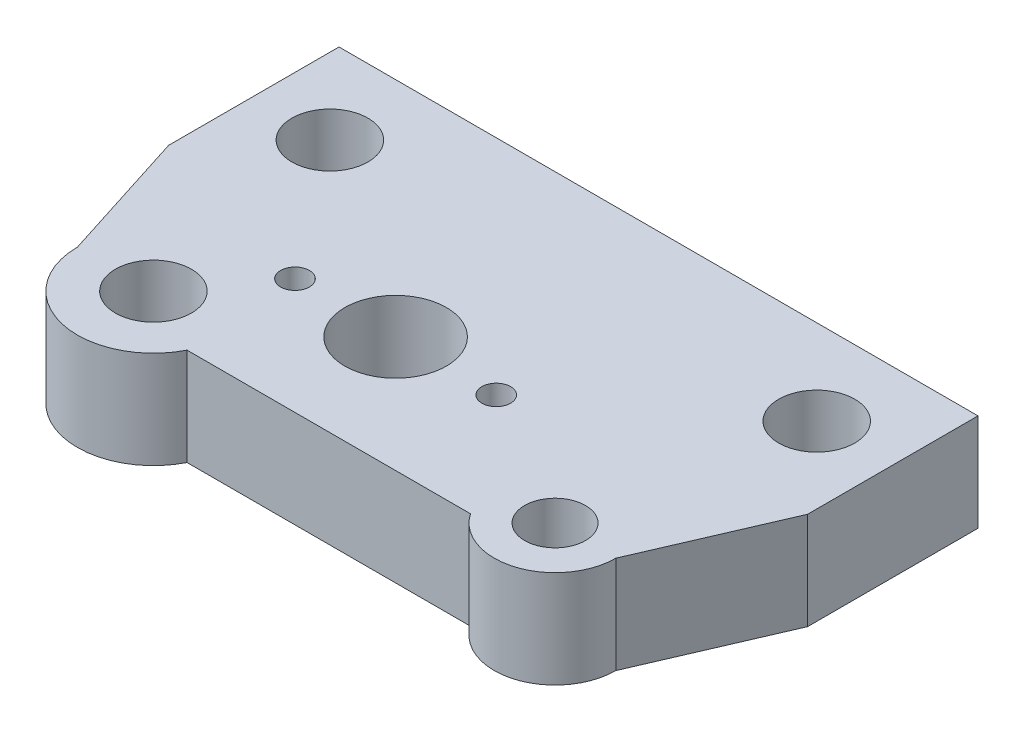
ISO-10303-21;
HEADER;
FILE_DESCRIPTION(('STEP AP214'),'2;1');
FILE_NAME('part.step','',(''),(''),'','','');
FILE_SCHEMA(('AUTOMOTIVE_DESIGN { 1 0 10303 214 1 1 1 1 }'));
ENDSEC;
DATA;
#1=APPLICATION_CONTEXT('core data for automotive mechanical design processes');
#2=APPLICATION_PROTOCOL_DEFINITION('international standard','automotive_design',2000,#1);
#3=PRODUCT_CONTEXT('',#1,'mechanical');
#4=PRODUCT('Part','Part','',(#3));
#5=PRODUCT_RELATED_PRODUCT_CATEGORY('part','',(#4));
#6=PRODUCT_DEFINITION_FORMATION('','',#4);
#7=PRODUCT_DEFINITION_CONTEXT('part definition',#1,'design');
#8=PRODUCT_DEFINITION('design','',#6,#7);
#9=PRODUCT_DEFINITION_SHAPE('','',#8);
#10=(LENGTH_UNIT() NAMED_UNIT(*) SI_UNIT(.MILLI.,.METRE.));
#11=(NAMED_UNIT(*) PLANE_ANGLE_UNIT() SI_UNIT($,.RADIAN.));
#12=(NAMED_UNIT(*) SI_UNIT($,.STERADIAN.) SOLID_ANGLE_UNIT());
#13=UNCERTAINTY_MEASURE_WITH_UNIT(LENGTH_MEASURE(1.E-05),#10,'distance_accuracy_value','');
#14=(GEOMETRIC_REPRESENTATION_CONTEXT(3) GLOBAL_UNCERTAINTY_ASSIGNED_CONTEXT((#13)) GLOBAL_UNIT_ASSIGNED_CONTEXT((#10,
#11,#12)) REPRESENTATION_CONTEXT('',''));
#15=CARTESIAN_POINT('',(0.,0.,0.));
#16=DIRECTION('',(0.,0.,1.));
#17=DIRECTION('',(1.,0.,0.));
#18=AXIS2_PLACEMENT_3D('',#15,#16,#17);
#19=CARTESIAN_POINT('',(41.91,-10.16,0.));
#20=DIRECTION('',(0.,1.,0.));
#21=DIRECTION('',(0.,0.,1.));
#22=AXIS2_PLACEMENT_3D('',#19,#20,#21);
#23=CYLINDRICAL_SURFACE('',#22,6.35);
#24=CARTESIAN_POINT('',(41.91,0.,0.));
#25=DIRECTION('',(0.,1.,0.));
#26=DIRECTION('',(0.,0.,1.));
#27=AXIS2_PLACEMENT_3D('',#24,#25,#26);
#28=CIRCLE('',#27,6.35);
#29=CARTESIAN_POINT('',(36.662919386102,0.,3.57640112840493));
#30=VERTEX_POINT('',#29);
#31=CARTESIAN_POINT('',(48.26,0.,0.));
#32=VERTEX_POINT('',#31);
#33=EDGE_CURVE('E133',#30,#32,#28,.T.);
#34=ORIENTED_EDGE('',*,*,#33,.F.);
#35=DIRECTION('',(0.,1.,0.));
#36=VECTOR('',#35,1.);
#37=CARTESIAN_POINT('',(36.662919386102,-10.16,3.57640112840493));
#38=LINE('',#37,#36);
#39=CARTESIAN_POINT('',(36.662919386102,-10.16,3.57640112840493));
#40=VERTEX_POINT('',#39);
#41=EDGE_CURVE('E11',#40,#30,#38,.T.);
#42=ORIENTED_EDGE('',*,*,#41,.F.);
#43=CARTESIAN_POINT('',(41.91,-10.16,0.));
#44=DIRECTION('',(0.,1.,0.));
#45=DIRECTION('',(0.,0.,1.));
#46=AXIS2_PLACEMENT_3D('',#43,#44,#45);
#47=CIRCLE('',#46,6.35);
#48=CARTESIAN_POINT('',(48.26,-10.16,0.));
#49=VERTEX_POINT('',#48);
#50=EDGE_CURVE('E154',#40,#49,#47,.T.);
#51=ORIENTED_EDGE('',*,*,#50,.T.);
#52=DIRECTION('',(0.,1.,0.));
#53=VECTOR('',#52,1.);
#54=CARTESIAN_POINT('',(48.26,-10.16,0.));
#55=LINE('',#54,#53);
#56=EDGE_CURVE('E39',#49,#32,#55,.T.);
#57=ORIENTED_EDGE('',*,*,#56,.T.);
#58=EDGE_LOOP('',(#34,#42,#51,#57));
#59=FACE_BOUND('',#58,.T.);
#60=ADVANCED_FACE('F36',(#59),#23,.T.);
#61=CARTESIAN_POINT('',(7.08613161172892,-10.16,3.57640112840493));
#62=DIRECTION('',(0.,0.,1.));
#63=DIRECTION('',(1.,0.,0.));
#64=AXIS2_PLACEMENT_3D('',#61,#62,#63);
#65=PLANE('',#64);
#66=DIRECTION('',(1.,0.,0.));
#67=VECTOR('',#66,1.);
#68=CARTESIAN_POINT('',(7.08613161172892,0.,3.57640112840493));
#69=LINE('',#68,#67);
#70=CARTESIAN_POINT('',(7.08613161172892,0.,3.57640112840493));
#71=VERTEX_POINT('',#70);
#72=EDGE_CURVE('E152',#71,#30,#69,.T.);
#73=ORIENTED_EDGE('',*,*,#72,.F.);
#74=DIRECTION('',(0.,1.,0.));
#75=VECTOR('',#74,1.);
#76=CARTESIAN_POINT('',(7.08613161172892,-10.16,3.57640112840493));
#77=LINE('',#76,#75);
#78=CARTESIAN_POINT('',(7.08613161172892,-10.16,3.57640112840493));
#79=VERTEX_POINT('',#78);
#80=EDGE_CURVE('E45',#79,#71,#77,.T.);
#81=ORIENTED_EDGE('',*,*,#80,.F.);
#82=DIRECTION('',(1.,0.,0.));
#83=VECTOR('',#82,1.);
#84=CARTESIAN_POINT('',(7.08613161172892,-10.16,3.57640112840493));
#85=LINE('',#84,#83);
#86=EDGE_CURVE('E123',#79,#40,#85,.T.);
#87=ORIENTED_EDGE('',*,*,#86,.T.);
#88=ORIENTED_EDGE('',*,*,#41,.T.);
#89=EDGE_LOOP('',(#73,#81,#87,#88));
#90=FACE_BOUND('',#89,.T.);
#91=ADVANCED_FACE('F166',(#90),#65,.T.);
#92=CARTESIAN_POINT('',(0.,-10.16,0.));
#93=DIRECTION('',(0.,1.,0.));
#94=DIRECTION('',(0.,0.,1.));
#95=AXIS2_PLACEMENT_3D('',#92,#93,#94);
#96=CYLINDRICAL_SURFACE('',#95,7.9375);
#97=CARTESIAN_POINT('',(0.,0.,0.));
#98=DIRECTION('',(0.,1.,0.));
#99=DIRECTION('',(0.,0.,-1.));
#100=AXIS2_PLACEMENT_3D('',#97,#98,#99);
#101=CIRCLE('',#100,7.9375);
#102=CARTESIAN_POINT('',(-7.9375,0.,0.));
#103=VERTEX_POINT('',#102);
#104=EDGE_CURVE('E110',#103,#71,#101,.T.);
#105=ORIENTED_EDGE('',*,*,#104,.F.);
#106=DIRECTION('',(0.,1.,0.));
#107=VECTOR('',#106,1.);
#108=CARTESIAN_POINT('',(-7.9375,-10.16,0.));
#109=LINE('',#108,#107);
#110=CARTESIAN_POINT('',(-7.9375,-10.16,0.));
#111=VERTEX_POINT('',#110);
#112=EDGE_CURVE('E105',#111,#103,#109,.T.);
#113=ORIENTED_EDGE('',*,*,#112,.F.);
#114=CARTESIAN_POINT('',(0.,-10.16,0.));
#115=DIRECTION('',(0.,1.,0.));
#116=DIRECTION('',(0.,0.,-1.));
#117=AXIS2_PLACEMENT_3D('',#114,#115,#116);
#118=CIRCLE('',#117,7.9375);
#119=EDGE_CURVE('E108',#111,#79,#118,.T.);
#120=ORIENTED_EDGE('',*,*,#119,.T.);
#121=ORIENTED_EDGE('',*,*,#80,.T.);
#122=EDGE_LOOP('',(#105,#113,#120,#121));
#123=FACE_BOUND('',#122,.T.);
#124=ADVANCED_FACE('F107',(#123),#96,.T.);
#125=CARTESIAN_POINT('',(-7.9375,-10.16,0.));
#126=DIRECTION('',(-0.952925780013262,0.,0.303203657276947));
#127=DIRECTION('',(0.303203657276947,0.,0.952925780013262));
#128=AXIS2_PLACEMENT_3D('',#125,#126,#127);
#129=PLANE('',#128);
#130=DIRECTION('',(0.303203657276947,0.,0.952925780013262));
#131=VECTOR('',#130,1.);
#132=CARTESIAN_POINT('',(-7.9375,0.,0.));
#133=LINE('',#132,#131);
#134=CARTESIAN_POINT('',(-12.3825,0.,-13.97));
#135=VERTEX_POINT('',#134);
#136=EDGE_CURVE('E149',#135,#103,#133,.T.);
#137=ORIENTED_EDGE('',*,*,#136,.F.);
#138=DIRECTION('',(0.,1.,0.));
#139=VECTOR('',#138,1.);
#140=CARTESIAN_POINT('',(-12.3825,-10.16,-13.97));
#141=LINE('',#140,#139);
#142=CARTESIAN_POINT('',(-12.3825,-10.16,-13.97));
#143=VERTEX_POINT('',#142);
#144=EDGE_CURVE('E115',#143,#135,#141,.T.);
#145=ORIENTED_EDGE('',*,*,#144,.F.);
#146=DIRECTION('',(0.303203657276947,0.,0.952925780013262));
#147=VECTOR('',#146,1.);
#148=CARTESIAN_POINT('',(-7.9375,-10.16,0.));
#149=LINE('',#148,#147);
#150=EDGE_CURVE('E121',#143,#111,#149,.T.);
#151=ORIENTED_EDGE('',*,*,#150,.T.);
#152=ORIENTED_EDGE('',*,*,#112,.T.);
#153=EDGE_LOOP('',(#137,#145,#151,#152));
#154=FACE_BOUND('',#153,.T.);
#155=ADVANCED_FACE('F125',(#154),#129,.T.);
#156=CARTESIAN_POINT('',(-12.3825,-10.16,-31.75));
#157=DIRECTION('',(-1.,0.,0.));
#158=DIRECTION('',(0.,0.,1.));
#159=AXIS2_PLACEMENT_3D('',#156,#157,#158);
#160=PLANE('',#159);
#161=DIRECTION('',(0.,0.,1.));
#162=VECTOR('',#161,1.);
#163=CARTESIAN_POINT('',(-12.3825,0.,-31.75));
#164=LINE('',#163,#162);
#165=CARTESIAN_POINT('',(-12.3825,0.,-31.75));
#166=VERTEX_POINT('',#165);
#167=EDGE_CURVE('E146',#166,#135,#164,.T.);
#168=ORIENTED_EDGE('',*,*,#167,.F.);
#169=DIRECTION('',(0.,1.,0.));
#170=VECTOR('',#169,1.);
#171=CARTESIAN_POINT('',(-12.3825,-10.16,-31.75));
#172=LINE('',#171,#170);
#173=CARTESIAN_POINT('',(-12.3825,-10.16,-31.75));
#174=VERTEX_POINT('',#173);
#175=EDGE_CURVE('E158',#174,#166,#172,.T.);
#176=ORIENTED_EDGE('',*,*,#175,.F.);
#177=DIRECTION('',(0.,0.,1.));
#178=VECTOR('',#177,1.);
#179=CARTESIAN_POINT('',(-12.3825,-10.16,-31.75));
#180=LINE('',#179,#178);
#181=EDGE_CURVE('E126',#174,#143,#180,.T.);
#182=ORIENTED_EDGE('',*,*,#181,.T.);
#183=ORIENTED_EDGE('',*,*,#144,.T.);
#184=EDGE_LOOP('',(#168,#176,#182,#183));
#185=FACE_BOUND('',#184,.T.);
#186=ADVANCED_FACE('F179',(#185),#160,.T.);
#187=CARTESIAN_POINT('',(54.2925,-10.16,-31.75));
#188=DIRECTION('',(0.,0.,-1.));
#189=DIRECTION('',(-1.,0.,0.));
#190=AXIS2_PLACEMENT_3D('',#187,#188,#189);
#191=PLANE('',#190);
#192=DIRECTION('',(-1.,0.,0.));
#193=VECTOR('',#192,1.);
#194=CARTESIAN_POINT('',(54.2925,0.,-31.75));
#195=LINE('',#194,#193);
#196=CARTESIAN_POINT('',(54.2925,0.,-31.75));
#197=VERTEX_POINT('',#196);
#198=EDGE_CURVE('E143',#197,#166,#195,.T.);
#199=ORIENTED_EDGE('',*,*,#198,.F.);
#200=DIRECTION('',(0.,1.,0.));
#201=VECTOR('',#200,1.);
#202=CARTESIAN_POINT('',(54.2925,-10.16,-31.75));
#203=LINE('',#202,#201);
#204=CARTESIAN_POINT('',(54.2925,-10.16,-31.75));
#205=VERTEX_POINT('',#204);
#206=EDGE_CURVE('E160',#205,#197,#203,.T.);
#207=ORIENTED_EDGE('',*,*,#206,.F.);
#208=DIRECTION('',(-1.,0.,0.));
#209=VECTOR('',#208,1.);
#210=CARTESIAN_POINT('',(54.2925,-10.16,-31.75));
#211=LINE('',#210,#209);
#212=EDGE_CURVE('E128',#205,#174,#211,.T.);
#213=ORIENTED_EDGE('',*,*,#212,.T.);
#214=ORIENTED_EDGE('',*,*,#175,.T.);
#215=EDGE_LOOP('',(#199,#207,#213,#214));
#216=FACE_BOUND('',#215,.T.);
#217=ADVANCED_FACE('F182',(#216),#191,.T.);
#218=CARTESIAN_POINT('',(54.2925,-10.16,-31.75));
#219=DIRECTION('',(1.,0.,0.));
#220=DIRECTION('',(0.,0.,-1.));
#221=AXIS2_PLACEMENT_3D('',#218,#219,#220);
#222=PLANE('',#221);
#223=DIRECTION('',(0.,0.,-1.));
#224=VECTOR('',#223,1.);
#225=CARTESIAN_POINT('',(54.2925,0.,-31.75));
#226=LINE('',#225,#224);
#227=CARTESIAN_POINT('',(54.2925,0.,-13.97));
#228=VERTEX_POINT('',#227);
#229=EDGE_CURVE('E140',#228,#197,#226,.T.);
#230=ORIENTED_EDGE('',*,*,#229,.F.);
#231=DIRECTION('',(0.,1.,0.));
#232=VECTOR('',#231,1.);
#233=CARTESIAN_POINT('',(54.2925,-10.16,-13.97));
#234=LINE('',#233,#232);
#235=CARTESIAN_POINT('',(54.2925,-10.16,-13.97));
#236=VERTEX_POINT('',#235);
#237=EDGE_CURVE('E161',#236,#228,#234,.T.);
#238=ORIENTED_EDGE('',*,*,#237,.F.);
#239=DIRECTION('',(0.,0.,-1.));
#240=VECTOR('',#239,1.);
#241=CARTESIAN_POINT('',(54.2925,-10.16,-31.75));
#242=LINE('',#241,#240);
#243=EDGE_CURVE('E278',#236,#205,#242,.T.);
#244=ORIENTED_EDGE('',*,*,#243,.T.);
#245=ORIENTED_EDGE('',*,*,#206,.T.);
#246=EDGE_LOOP('',(#230,#238,#244,#245));
#247=FACE_BOUND('',#246,.T.);
#248=ADVANCED_FACE('F186',(#247),#222,.T.);
#249=CARTESIAN_POINT('',(48.26,-10.16,0.));
#250=DIRECTION('',(0.918062353536191,0.,0.396436016299718));
#251=DIRECTION('',(0.396436016299718,0.,-0.918062353536191));
#252=AXIS2_PLACEMENT_3D('',#249,#250,#251);
#253=PLANE('',#252);
#254=DIRECTION('',(0.396436016299718,0.,-0.918062353536191));
#255=VECTOR('',#254,1.);
#256=CARTESIAN_POINT('',(48.26,0.,0.));
#257=LINE('',#256,#255);
#258=EDGE_CURVE('E136',#32,#228,#257,.T.);
#259=ORIENTED_EDGE('',*,*,#258,.F.);
#260=ORIENTED_EDGE('',*,*,#56,.F.);
#261=DIRECTION('',(0.396436016299718,0.,-0.918062353536191));
#262=VECTOR('',#261,1.);
#263=CARTESIAN_POINT('',(48.26,-10.16,0.));
#264=LINE('',#263,#262);
#265=EDGE_CURVE('E276',#49,#236,#264,.T.);
#266=ORIENTED_EDGE('',*,*,#265,.T.);
#267=ORIENTED_EDGE('',*,*,#237,.T.);
#268=EDGE_LOOP('',(#259,#260,#266,#267));
#269=FACE_BOUND('',#268,.T.);
#270=ADVANCED_FACE('F163',(#269),#253,.T.);
#271=CARTESIAN_POINT('',(41.91,-10.16,0.));
#272=DIRECTION('',(0.,1.,0.));
#273=DIRECTION('',(0.,0.,1.));
#274=AXIS2_PLACEMENT_3D('',#271,#272,#273);
#275=PLANE('',#274);
#276=CARTESIAN_POINT('',(27.264,-10.16,-8.50900000000001));
#277=DIRECTION('',(0.,1.,0.));
#278=DIRECTION('',(0.,0.,1.));
#279=AXIS2_PLACEMENT_3D('',#276,#277,#278);
#280=CIRCLE('',#279,1.5);
#281=CARTESIAN_POINT('',(27.264,-10.16,-7.009));
#282=VERTEX_POINT('',#281);
#283=EDGE_CURVE('E233',#282,#282,#280,.T.);
#284=ORIENTED_EDGE('',*,*,#283,.T.);
#285=EDGE_LOOP('',(#284));
#286=FACE_BOUND('',#285,.T.);
#287=CARTESIAN_POINT('',(6.264,-10.16,-8.509));
#288=DIRECTION('',(0.,1.,0.));
#289=DIRECTION('',(0.,0.,1.));
#290=AXIS2_PLACEMENT_3D('',#287,#288,#289);
#291=CIRCLE('',#290,1.5);
#292=CARTESIAN_POINT('',(6.264,-10.16,-7.009));
#293=VERTEX_POINT('',#292);
#294=EDGE_CURVE('E241',#293,#293,#291,.T.);
#295=ORIENTED_EDGE('',*,*,#294,.T.);
#296=EDGE_LOOP('',(#295));
#297=FACE_BOUND('',#296,.T.);
#298=CARTESIAN_POINT('',(16.764,-10.16,-8.509));
#299=DIRECTION('',(0.,1.,0.));
#300=DIRECTION('',(0.,0.,1.));
#301=AXIS2_PLACEMENT_3D('',#298,#299,#300);
#302=CIRCLE('',#301,5.30000000000002);
#303=CARTESIAN_POINT('',(16.764,-10.16,-3.20899999999999));
#304=VERTEX_POINT('',#303);
#305=EDGE_CURVE('E247',#304,#304,#302,.T.);
#306=ORIENTED_EDGE('',*,*,#305,.T.);
#307=EDGE_LOOP('',(#306));
#308=FACE_BOUND('',#307,.T.);
#309=CARTESIAN_POINT('',(-4.445,-10.16,-22.86));
#310=DIRECTION('',(0.,1.,0.));
#311=DIRECTION('',(0.,0.,1.));
#312=AXIS2_PLACEMENT_3D('',#309,#310,#311);
#313=CIRCLE('',#312,3.96875);
#314=CARTESIAN_POINT('',(-4.445,-10.16,-18.89125));
#315=VERTEX_POINT('',#314);
#316=EDGE_CURVE('E253',#315,#315,#313,.T.);
#317=ORIENTED_EDGE('',*,*,#316,.T.);
#318=EDGE_LOOP('',(#317));
#319=FACE_BOUND('',#318,.T.);
#320=CARTESIAN_POINT('',(46.355,-10.16,-22.86));
#321=DIRECTION('',(0.,1.,0.));
#322=DIRECTION('',(0.,0.,1.));
#323=AXIS2_PLACEMENT_3D('',#320,#321,#322);
#324=CIRCLE('',#323,3.96875000000001);
#325=CARTESIAN_POINT('',(46.355,-10.16,-18.89125));
#326=VERTEX_POINT('',#325);
#327=EDGE_CURVE('E259',#326,#326,#324,.T.);
#328=ORIENTED_EDGE('',*,*,#327,.T.);
#329=EDGE_LOOP('',(#328));
#330=FACE_BOUND('',#329,.T.);
#331=CARTESIAN_POINT('',(41.91,-10.16,0.));
#332=DIRECTION('',(0.,1.,0.));
#333=DIRECTION('',(0.,0.,1.));
#334=AXIS2_PLACEMENT_3D('',#331,#332,#333);
#335=CIRCLE('',#334,3.175);
#336=CARTESIAN_POINT('',(41.91,-10.16,3.175));
#337=VERTEX_POINT('',#336);
#338=EDGE_CURVE('E265',#337,#337,#335,.T.);
#339=ORIENTED_EDGE('',*,*,#338,.T.);
#340=EDGE_LOOP('',(#339));
#341=FACE_BOUND('',#340,.T.);
#342=CARTESIAN_POINT('',(0.,-10.16,0.));
#343=DIRECTION('',(0.,1.,0.));
#344=DIRECTION('',(0.,0.,1.));
#345=AXIS2_PLACEMENT_3D('',#342,#343,#344);
#346=CIRCLE('',#345,3.96875);
#347=CARTESIAN_POINT('',(0.,-10.16,3.96875));
#348=VERTEX_POINT('',#347);
#349=EDGE_CURVE('E137',#348,#348,#346,.T.);
#350=ORIENTED_EDGE('',*,*,#349,.T.);
#351=EDGE_LOOP('',(#350));
#352=FACE_BOUND('',#351,.T.);
#353=ORIENTED_EDGE('',*,*,#50,.F.);
#354=ORIENTED_EDGE('',*,*,#86,.F.);
#355=ORIENTED_EDGE('',*,*,#119,.F.);
#356=ORIENTED_EDGE('',*,*,#150,.F.);
#357=ORIENTED_EDGE('',*,*,#181,.F.);
#358=ORIENTED_EDGE('',*,*,#212,.F.);
#359=ORIENTED_EDGE('',*,*,#243,.F.);
#360=ORIENTED_EDGE('',*,*,#265,.F.);
#361=EDGE_LOOP('',(#353,#354,#355,#356,#357,#358,#359,#360));
#362=FACE_BOUND('',#361,.T.);
#363=ADVANCED_FACE('F119',(#286,#297,#308,#319,#330,#341,#352,#362),#275,.F.);
#364=CARTESIAN_POINT('',(41.91,0.,0.));
#365=DIRECTION('',(0.,1.,0.));
#366=DIRECTION('',(0.,0.,1.));
#367=AXIS2_PLACEMENT_3D('',#364,#365,#366);
#368=PLANE('',#367);
#369=CARTESIAN_POINT('',(27.264,0.,-8.50900000000001));
#370=DIRECTION('',(0.,1.,0.));
#371=DIRECTION('',(0.,0.,1.));
#372=AXIS2_PLACEMENT_3D('',#369,#370,#371);
#373=CIRCLE('',#372,1.5);
#374=CARTESIAN_POINT('',(27.264,0.,-7.009));
#375=VERTEX_POINT('',#374);
#376=EDGE_CURVE('E236',#375,#375,#373,.T.);
#377=ORIENTED_EDGE('',*,*,#376,.F.);
#378=EDGE_LOOP('',(#377));
#379=FACE_BOUND('',#378,.T.);
#380=CARTESIAN_POINT('',(6.264,0.,-8.509));
#381=DIRECTION('',(0.,1.,0.));
#382=DIRECTION('',(0.,0.,1.));
#383=AXIS2_PLACEMENT_3D('',#380,#381,#382);
#384=CIRCLE('',#383,1.5);
#385=CARTESIAN_POINT('',(6.264,0.,-7.009));
#386=VERTEX_POINT('',#385);
#387=EDGE_CURVE('E238',#386,#386,#384,.T.);
#388=ORIENTED_EDGE('',*,*,#387,.F.);
#389=EDGE_LOOP('',(#388));
#390=FACE_BOUND('',#389,.T.);
#391=CARTESIAN_POINT('',(16.764,0.,-8.509));
#392=DIRECTION('',(0.,1.,0.));
#393=DIRECTION('',(0.,0.,1.));
#394=AXIS2_PLACEMENT_3D('',#391,#392,#393);
#395=CIRCLE('',#394,5.30000000000002);
#396=CARTESIAN_POINT('',(16.764,0.,-3.20899999999999));
#397=VERTEX_POINT('',#396);
#398=EDGE_CURVE('E244',#397,#397,#395,.T.);
#399=ORIENTED_EDGE('',*,*,#398,.F.);
#400=EDGE_LOOP('',(#399));
#401=FACE_BOUND('',#400,.T.);
#402=CARTESIAN_POINT('',(-4.445,0.,-22.86));
#403=DIRECTION('',(0.,1.,0.));
#404=DIRECTION('',(0.,0.,1.));
#405=AXIS2_PLACEMENT_3D('',#402,#403,#404);
#406=CIRCLE('',#405,3.96875);
#407=CARTESIAN_POINT('',(-4.445,0.,-18.89125));
#408=VERTEX_POINT('',#407);
#409=EDGE_CURVE('E250',#408,#408,#406,.T.);
#410=ORIENTED_EDGE('',*,*,#409,.F.);
#411=EDGE_LOOP('',(#410));
#412=FACE_BOUND('',#411,.T.);
#413=CARTESIAN_POINT('',(46.355,0.,-22.86));
#414=DIRECTION('',(0.,1.,0.));
#415=DIRECTION('',(0.,0.,1.));
#416=AXIS2_PLACEMENT_3D('',#413,#414,#415);
#417=CIRCLE('',#416,3.96875000000001);
#418=CARTESIAN_POINT('',(46.355,0.,-18.89125));
#419=VERTEX_POINT('',#418);
#420=EDGE_CURVE('E256',#419,#419,#417,.T.);
#421=ORIENTED_EDGE('',*,*,#420,.F.);
#422=EDGE_LOOP('',(#421));
#423=FACE_BOUND('',#422,.T.);
#424=CARTESIAN_POINT('',(41.91,0.,0.));
#425=DIRECTION('',(0.,1.,0.));
#426=DIRECTION('',(0.,0.,1.));
#427=AXIS2_PLACEMENT_3D('',#424,#425,#426);
#428=CIRCLE('',#427,3.175);
#429=CARTESIAN_POINT('',(41.91,0.,3.175));
#430=VERTEX_POINT('',#429);
#431=EDGE_CURVE('E262',#430,#430,#428,.T.);
#432=ORIENTED_EDGE('',*,*,#431,.F.);
#433=EDGE_LOOP('',(#432));
#434=FACE_BOUND('',#433,.T.);
#435=CARTESIAN_POINT('',(0.,0.,0.));
#436=DIRECTION('',(0.,1.,0.));
#437=DIRECTION('',(0.,0.,1.));
#438=AXIS2_PLACEMENT_3D('',#435,#436,#437);
#439=CIRCLE('',#438,3.96875);
#440=CARTESIAN_POINT('',(0.,0.,3.96875));
#441=VERTEX_POINT('',#440);
#442=EDGE_CURVE('E268',#441,#441,#439,.T.);
#443=ORIENTED_EDGE('',*,*,#442,.F.);
#444=EDGE_LOOP('',(#443));
#445=FACE_BOUND('',#444,.T.);
#446=ORIENTED_EDGE('',*,*,#33,.T.);
#447=ORIENTED_EDGE('',*,*,#258,.T.);
#448=ORIENTED_EDGE('',*,*,#229,.T.);
#449=ORIENTED_EDGE('',*,*,#198,.T.);
#450=ORIENTED_EDGE('',*,*,#167,.T.);
#451=ORIENTED_EDGE('',*,*,#136,.T.);
#452=ORIENTED_EDGE('',*,*,#104,.T.);
#453=ORIENTED_EDGE('',*,*,#72,.T.);
#454=EDGE_LOOP('',(#446,#447,#448,#449,#450,#451,#452,#453));
#455=FACE_BOUND('',#454,.T.);
#456=ADVANCED_FACE('F165',(#379,#390,#401,#412,#423,#434,#445,#455),#368,.T.);
#457=CARTESIAN_POINT('',(0.,-10.16,0.));
#458=DIRECTION('',(0.,1.,0.));
#459=DIRECTION('',(0.,0.,1.));
#460=AXIS2_PLACEMENT_3D('',#457,#458,#459);
#461=CYLINDRICAL_SURFACE('',#460,3.96875);
#462=ORIENTED_EDGE('',*,*,#349,.F.);
#463=EDGE_LOOP('',(#462));
#464=FACE_BOUND('',#463,.T.);
#465=ORIENTED_EDGE('',*,*,#442,.T.);
#466=EDGE_LOOP('',(#465));
#467=FACE_BOUND('',#466,.T.);
#468=ADVANCED_FACE('F198',(#464,#467),#461,.F.);
#469=CARTESIAN_POINT('',(41.91,-10.16,0.));
#470=DIRECTION('',(0.,1.,0.));
#471=DIRECTION('',(0.,0.,1.));
#472=AXIS2_PLACEMENT_3D('',#469,#470,#471);
#473=CYLINDRICAL_SURFACE('',#472,3.175);
#474=ORIENTED_EDGE('',*,*,#338,.F.);
#475=EDGE_LOOP('',(#474));
#476=FACE_BOUND('',#475,.T.);
#477=ORIENTED_EDGE('',*,*,#431,.T.);
#478=EDGE_LOOP('',(#477));
#479=FACE_BOUND('',#478,.T.);
#480=ADVANCED_FACE('F205',(#476,#479),#473,.F.);
#481=CARTESIAN_POINT('',(46.355,-10.16,-22.86));
#482=DIRECTION('',(0.,1.,0.));
#483=DIRECTION('',(0.,0.,1.));
#484=AXIS2_PLACEMENT_3D('',#481,#482,#483);
#485=CYLINDRICAL_SURFACE('',#484,3.96875000000001);
#486=ORIENTED_EDGE('',*,*,#327,.F.);
#487=EDGE_LOOP('',(#486));
#488=FACE_BOUND('',#487,.T.);
#489=ORIENTED_EDGE('',*,*,#420,.T.);
#490=EDGE_LOOP('',(#489));
#491=FACE_BOUND('',#490,.T.);
#492=ADVANCED_FACE('F209',(#488,#491),#485,.F.);
#493=CARTESIAN_POINT('',(-4.445,-10.16,-22.86));
#494=DIRECTION('',(0.,1.,0.));
#495=DIRECTION('',(0.,0.,1.));
#496=AXIS2_PLACEMENT_3D('',#493,#494,#495);
#497=CYLINDRICAL_SURFACE('',#496,3.96875);
#498=ORIENTED_EDGE('',*,*,#316,.F.);
#499=EDGE_LOOP('',(#498));
#500=FACE_BOUND('',#499,.T.);
#501=ORIENTED_EDGE('',*,*,#409,.T.);
#502=EDGE_LOOP('',(#501));
#503=FACE_BOUND('',#502,.T.);
#504=ADVANCED_FACE('F213',(#500,#503),#497,.F.);
#505=CARTESIAN_POINT('',(16.764,-10.16,-8.509));
#506=DIRECTION('',(0.,1.,0.));
#507=DIRECTION('',(0.,0.,1.));
#508=AXIS2_PLACEMENT_3D('',#505,#506,#507);
#509=CYLINDRICAL_SURFACE('',#508,5.30000000000002);
#510=ORIENTED_EDGE('',*,*,#305,.F.);
#511=EDGE_LOOP('',(#510));
#512=FACE_BOUND('',#511,.T.);
#513=ORIENTED_EDGE('',*,*,#398,.T.);
#514=EDGE_LOOP('',(#513));
#515=FACE_BOUND('',#514,.T.);
#516=ADVANCED_FACE('F217',(#512,#515),#509,.F.);
#517=CARTESIAN_POINT('',(6.264,-10.16,-8.509));
#518=DIRECTION('',(0.,1.,0.));
#519=DIRECTION('',(0.,0.,1.));
#520=AXIS2_PLACEMENT_3D('',#517,#518,#519);
#521=CYLINDRICAL_SURFACE('',#520,1.5);
#522=ORIENTED_EDGE('',*,*,#294,.F.);
#523=EDGE_LOOP('',(#522));
#524=FACE_BOUND('',#523,.T.);
#525=ORIENTED_EDGE('',*,*,#387,.T.);
#526=EDGE_LOOP('',(#525));
#527=FACE_BOUND('',#526,.T.);
#528=ADVANCED_FACE('F221',(#524,#527),#521,.F.);
#529=CARTESIAN_POINT('',(27.264,-10.16,-8.50900000000001));
#530=DIRECTION('',(0.,1.,0.));
#531=DIRECTION('',(0.,0.,1.));
#532=AXIS2_PLACEMENT_3D('',#529,#530,#531);
#533=CYLINDRICAL_SURFACE('',#532,1.5);
#534=ORIENTED_EDGE('',*,*,#283,.F.);
#535=EDGE_LOOP('',(#534));
#536=FACE_BOUND('',#535,.T.);
#537=ORIENTED_EDGE('',*,*,#376,.T.);
#538=EDGE_LOOP('',(#537));
#539=FACE_BOUND('',#538,.T.);
#540=ADVANCED_FACE('F225',(#536,#539),#533,.F.);
#541=CLOSED_SHELL('',(#60,#91,#124,#155,#186,#217,#248,#270,#363,#456,#468,#480,#492,#504,#516,
#528,#540));
#542=MANIFOLD_SOLID_BREP('B2',#541);
#543=ADVANCED_BREP_SHAPE_REPRESENTATION('',(#18,#542),#14);
#544=SHAPE_DEFINITION_REPRESENTATION(#9,#543);
ENDSEC;
END-ISO-10303-21;
